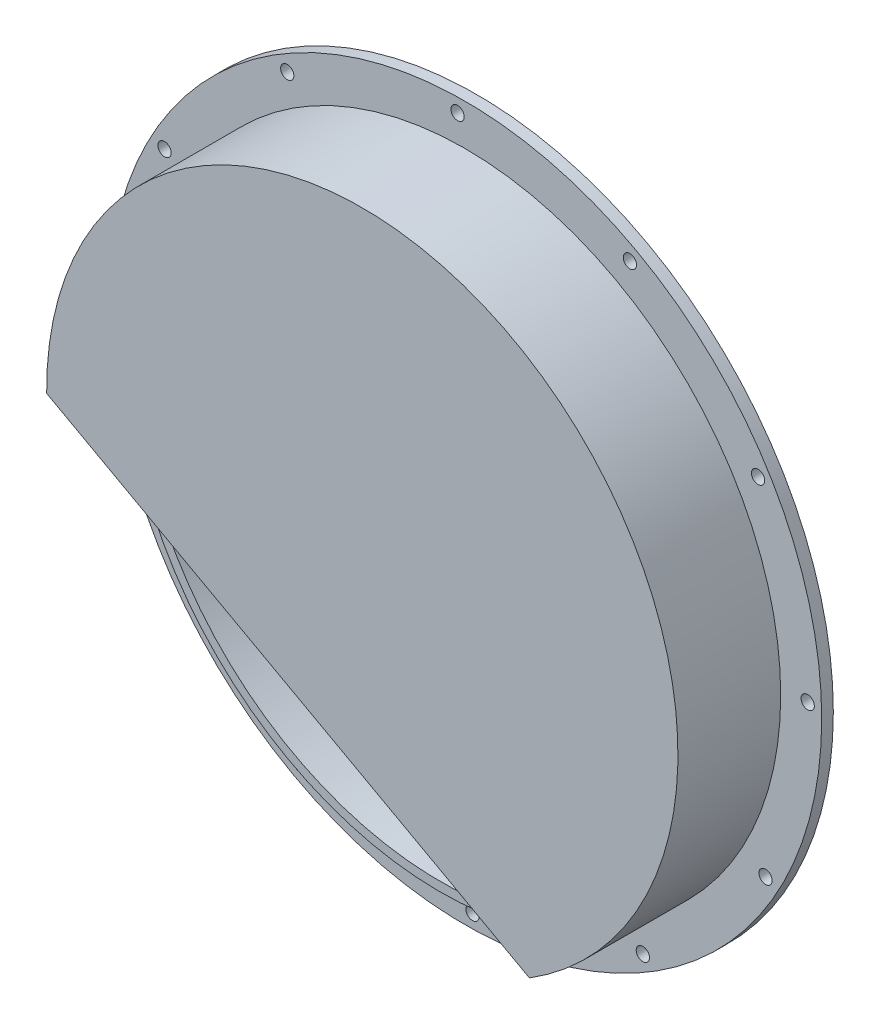
ISO-10303-21;
HEADER;
FILE_DESCRIPTION(('STEP AP214'),'2;1');
FILE_NAME('part.step','',(''),(''),'','','');
FILE_SCHEMA(('AUTOMOTIVE_DESIGN { 1 0 10303 214 1 1 1 1 }'));
ENDSEC;
DATA;
#1=APPLICATION_CONTEXT('core data for automotive mechanical design processes');
#2=APPLICATION_PROTOCOL_DEFINITION('international standard','automotive_design',2000,#1);
#3=PRODUCT_CONTEXT('',#1,'mechanical');
#4=PRODUCT('Part','Part','',(#3));
#5=PRODUCT_RELATED_PRODUCT_CATEGORY('part','',(#4));
#6=PRODUCT_DEFINITION_FORMATION('','',#4);
#7=PRODUCT_DEFINITION_CONTEXT('part definition',#1,'design');
#8=PRODUCT_DEFINITION('design','',#6,#7);
#9=PRODUCT_DEFINITION_SHAPE('','',#8);
#10=(LENGTH_UNIT() NAMED_UNIT(*) SI_UNIT(.MILLI.,.METRE.));
#11=(NAMED_UNIT(*) PLANE_ANGLE_UNIT() SI_UNIT($,.RADIAN.));
#12=(NAMED_UNIT(*) SI_UNIT($,.STERADIAN.) SOLID_ANGLE_UNIT());
#13=UNCERTAINTY_MEASURE_WITH_UNIT(LENGTH_MEASURE(1.E-05),#10,'distance_accuracy_value','');
#14=(GEOMETRIC_REPRESENTATION_CONTEXT(3) GLOBAL_UNCERTAINTY_ASSIGNED_CONTEXT((#13)) GLOBAL_UNIT_ASSIGNED_CONTEXT((#10,
#11,#12)) REPRESENTATION_CONTEXT('',''));
#15=CARTESIAN_POINT('',(0.,0.,0.));
#16=DIRECTION('',(0.,0.,1.));
#17=DIRECTION('',(1.,0.,0.));
#18=AXIS2_PLACEMENT_3D('',#15,#16,#17);
#19=CARTESIAN_POINT('',(0.,0.,0.));
#20=DIRECTION('',(0.,0.,1.));
#21=DIRECTION('',(1.,0.,0.));
#22=AXIS2_PLACEMENT_3D('',#19,#20,#21);
#23=PLANE('',#22);
#24=CARTESIAN_POINT('',(-121.492546333434,-69.9540973807886,0.));
#25=DIRECTION('',(0.,0.,-1.));
#26=DIRECTION('',(-1.,0.,0.));
#27=AXIS2_PLACEMENT_3D('',#24,#25,#26);
#28=CIRCLE('',#27,1.45);
#29=CARTESIAN_POINT('',(-122.942546333434,-69.9540973807886,0.));
#30=VERTEX_POINT('',#29);
#31=EDGE_CURVE('E166',#30,#30,#28,.T.);
#32=ORIENTED_EDGE('',*,*,#31,.F.);
#33=EDGE_LOOP('',(#32));
#34=FACE_BOUND('',#33,.T.);
#35=CARTESIAN_POINT('',(-57.4334190667852,-31.0833742869837,0.));
#36=DIRECTION('',(0.,0.,-1.));
#37=DIRECTION('',(-1.,0.,0.));
#38=AXIS2_PLACEMENT_3D('',#35,#36,#37);
#39=CIRCLE('',#38,1.44999999999999);
#40=CARTESIAN_POINT('',(-58.8834190667852,-31.0833742869837,0.));
#41=VERTEX_POINT('',#40);
#42=EDGE_CURVE('E163',#41,#41,#39,.T.);
#43=ORIENTED_EDGE('',*,*,#42,.F.);
#44=EDGE_LOOP('',(#43));
#45=FACE_BOUND('',#44,.T.);
#46=CARTESIAN_POINT('',(-48.2138232587343,6.5915657526732,0.));
#47=DIRECTION('',(0.,0.,-1.));
#48=DIRECTION('',(-1.,0.,0.));
#49=AXIS2_PLACEMENT_3D('',#46,#47,#48);
#50=CIRCLE('',#49,1.44999999999999);
#51=CARTESIAN_POINT('',(-49.6638232587343,6.5915657526732,0.));
#52=VERTEX_POINT('',#51);
#53=EDGE_CURVE('E175',#52,#52,#50,.T.);
#54=ORIENTED_EDGE('',*,*,#53,.F.);
#55=EDGE_LOOP('',(#54));
#56=FACE_BOUND('',#55,.T.);
#57=CARTESIAN_POINT('',(-59.0668890961661,43.8288188170972,0.));
#58=DIRECTION('',(0.,0.,-1.));
#59=DIRECTION('',(-1.,0.,0.));
#60=AXIS2_PLACEMENT_3D('',#57,#58,#59);
#61=CIRCLE('',#60,1.44999999999999);
#62=CARTESIAN_POINT('',(-60.5168890961661,43.8288188170972,0.));
#63=VERTEX_POINT('',#62);
#64=EDGE_CURVE('E181',#63,#63,#61,.T.);
#65=ORIENTED_EDGE('',*,*,#64,.F.);
#66=EDGE_LOOP('',(#65));
#67=FACE_BOUND('',#66,.T.);
#68=CARTESIAN_POINT('',(-87.0845463525391,70.6506930193223,0.));
#69=DIRECTION('',(0.,0.,-1.));
#70=DIRECTION('',(-1.,0.,0.));
#71=AXIS2_PLACEMENT_3D('',#68,#69,#70);
#72=CIRCLE('',#71,1.45);
#73=CARTESIAN_POINT('',(-88.5345463525391,70.6506930193223,0.));
#74=VERTEX_POINT('',#73);
#75=EDGE_CURVE('E187',#74,#74,#72,.T.);
#76=ORIENTED_EDGE('',*,*,#75,.F.);
#77=EDGE_LOOP('',(#76));
#78=FACE_BOUND('',#77,.T.);
#79=CARTESIAN_POINT('',(-124.759486392196,79.8702888273732,0.));
#80=DIRECTION('',(0.,0.,-1.));
#81=DIRECTION('',(-1.,0.,0.));
#82=AXIS2_PLACEMENT_3D('',#79,#80,#81);
#83=CIRCLE('',#82,1.45);
#84=CARTESIAN_POINT('',(-126.209486392196,79.8702888273732,0.));
#85=VERTEX_POINT('',#84);
#86=EDGE_CURVE('E193',#85,#85,#83,.T.);
#87=ORIENTED_EDGE('',*,*,#86,.F.);
#88=EDGE_LOOP('',(#87));
#89=FACE_BOUND('',#88,.T.);
#90=CARTESIAN_POINT('',(-161.99673945662,69.0172229899414,0.));
#91=DIRECTION('',(0.,0.,-1.));
#92=DIRECTION('',(-1.,0.,0.));
#93=AXIS2_PLACEMENT_3D('',#90,#91,#92);
#94=CIRCLE('',#93,1.44999999999998);
#95=CARTESIAN_POINT('',(-163.44673945662,69.0172229899414,0.));
#96=VERTEX_POINT('',#95);
#97=EDGE_CURVE('E199',#96,#96,#94,.T.);
#98=ORIENTED_EDGE('',*,*,#97,.F.);
#99=EDGE_LOOP('',(#98));
#100=FACE_BOUND('',#99,.T.);
#101=CARTESIAN_POINT('',(-188.818613658845,40.9995657335684,0.));
#102=DIRECTION('',(0.,0.,-1.));
#103=DIRECTION('',(-1.,0.,0.));
#104=AXIS2_PLACEMENT_3D('',#101,#102,#103);
#105=CIRCLE('',#104,1.44999999999998);
#106=CARTESIAN_POINT('',(-190.268613658845,40.9995657335684,0.));
#107=VERTEX_POINT('',#106);
#108=EDGE_CURVE('E205',#107,#107,#105,.T.);
#109=ORIENTED_EDGE('',*,*,#108,.F.);
#110=EDGE_LOOP('',(#109));
#111=FACE_BOUND('',#110,.T.);
#112=CARTESIAN_POINT('',(-198.038209466896,3.32462569391143,0.));
#113=DIRECTION('',(0.,0.,-1.));
#114=DIRECTION('',(-1.,0.,0.));
#115=AXIS2_PLACEMENT_3D('',#112,#113,#114);
#116=CIRCLE('',#115,1.44999999999998);
#117=CARTESIAN_POINT('',(-199.488209466896,3.32462569391143,0.));
#118=VERTEX_POINT('',#117);
#119=EDGE_CURVE('E211',#118,#118,#116,.T.);
#120=ORIENTED_EDGE('',*,*,#119,.F.);
#121=EDGE_LOOP('',(#120));
#122=FACE_BOUND('',#121,.T.);
#123=CARTESIAN_POINT('',(-187.185143629464,-33.9126273705125,0.));
#124=DIRECTION('',(0.,0.,-1.));
#125=DIRECTION('',(-1.,0.,0.));
#126=AXIS2_PLACEMENT_3D('',#123,#124,#125);
#127=CIRCLE('',#126,1.44999999999998);
#128=CARTESIAN_POINT('',(-188.635143629464,-33.9126273705125,0.));
#129=VERTEX_POINT('',#128);
#130=EDGE_CURVE('E217',#129,#129,#127,.T.);
#131=ORIENTED_EDGE('',*,*,#130,.F.);
#132=EDGE_LOOP('',(#131));
#133=FACE_BOUND('',#132,.T.);
#134=CARTESIAN_POINT('',(-159.167486373091,-60.7345015727377,0.));
#135=DIRECTION('',(0.,0.,-1.));
#136=DIRECTION('',(-1.,0.,0.));
#137=AXIS2_PLACEMENT_3D('',#134,#135,#136);
#138=CIRCLE('',#137,1.44999999999998);
#139=CARTESIAN_POINT('',(-160.617486373091,-60.7345015727377,0.));
#140=VERTEX_POINT('',#139);
#141=EDGE_CURVE('E223',#140,#140,#138,.T.);
#142=ORIENTED_EDGE('',*,*,#141,.F.);
#143=EDGE_LOOP('',(#142));
#144=FACE_BOUND('',#143,.T.);
#145=CARTESIAN_POINT('',(-123.126016362815,4.95809572329235,0.));
#146=DIRECTION('',(0.,0.,1.));
#147=DIRECTION('',(1.,0.,0.));
#148=AXIS2_PLACEMENT_3D('',#145,#146,#147);
#149=CIRCLE('',#148,77.978);
#150=CARTESIAN_POINT('',(-45.1480163628152,4.95809572329235,0.));
#151=VERTEX_POINT('',#150);
#152=EDGE_CURVE('E142',#151,#151,#149,.T.);
#153=ORIENTED_EDGE('',*,*,#152,.F.);
#154=EDGE_LOOP('',(#153));
#155=FACE_BOUND('',#154,.T.);
#156=CARTESIAN_POINT('',(-123.126016362815,4.95809572329236,0.));
#157=DIRECTION('',(0.,0.,1.));
#158=DIRECTION('',(1.,0.,0.));
#159=AXIS2_PLACEMENT_3D('',#156,#157,#158);
#160=CIRCLE('',#159,67.0115996692061);
#161=CARTESIAN_POINT('',(-56.1144166936093,4.95809572329236,0.));
#162=VERTEX_POINT('',#161);
#163=EDGE_CURVE('E139',#162,#162,#160,.T.);
#164=ORIENTED_EDGE('',*,*,#163,.T.);
#165=EDGE_LOOP('',(#164));
#166=FACE_BOUND('',#165,.T.);
#167=CARTESIAN_POINT('',(-84.2552932690104,-59.1010315433568,0.));
#168=DIRECTION('',(0.,0.,-1.));
#169=DIRECTION('',(-1.,0.,0.));
#170=AXIS2_PLACEMENT_3D('',#167,#168,#169);
#171=CIRCLE('',#170,1.45);
#172=CARTESIAN_POINT('',(-85.7052932690104,-59.1010315433568,0.));
#173=VERTEX_POINT('',#172);
#174=EDGE_CURVE('E157',#173,#173,#171,.T.);
#175=ORIENTED_EDGE('',*,*,#174,.F.);
#176=EDGE_LOOP('',(#175));
#177=FACE_BOUND('',#176,.T.);
#178=ADVANCED_FACE('F17',(#34,#45,#56,#67,#78,#89,#100,#111,#122,#133,#144,#155,#166,#177),#23,.F.);
#179=CARTESIAN_POINT('',(-123.126016362815,4.95809572329236,2.54));
#180=DIRECTION('',(0.,0.,-1.));
#181=DIRECTION('',(-1.,0.,0.));
#182=AXIS2_PLACEMENT_3D('',#179,#180,#181);
#183=CYLINDRICAL_SURFACE('',#182,67.0115996692061);
#184=DIRECTION('',(0.,0.,1.));
#185=VECTOR('',#184,1.);
#186=CARTESIAN_POINT('',(-190.135379647443,5.50556482266202,-110.616161101414));
#187=LINE('',#186,#185);
#188=CARTESIAN_POINT('',(-190.135379647443,5.50556482266201,8.5));
#189=VERTEX_POINT('',#188);
#190=CARTESIAN_POINT('',(-190.135379647443,5.50556482266202,23.));
#191=VERTEX_POINT('',#190);
#192=EDGE_CURVE('E98',#189,#191,#187,.T.);
#193=ORIENTED_EDGE('',*,*,#192,.F.);
#194=CARTESIAN_POINT('',(-123.126016362815,4.95809572329236,8.5));
#195=DIRECTION('',(0.,0.,1.));
#196=DIRECTION('',(1.,0.,0.));
#197=AXIS2_PLACEMENT_3D('',#194,#195,#196);
#198=CIRCLE('',#197,67.0115996692061);
#199=CARTESIAN_POINT('',(-190.114892929167,3.2131296479842,8.5));
#200=VERTEX_POINT('',#199);
#201=EDGE_CURVE('E36',#189,#200,#198,.T.);
#202=ORIENTED_EDGE('',*,*,#201,.T.);
#203=DIRECTION('',(0.,0.,1.));
#204=VECTOR('',#203,1.);
#205=CARTESIAN_POINT('',(-190.114892929167,3.2131296479842,-110.616161101414));
#206=LINE('',#205,#204);
#207=CARTESIAN_POINT('',(-190.114892929167,3.2131296479842,8.00000002799998));
#208=VERTEX_POINT('',#207);
#209=EDGE_CURVE('E88',#200,#208,#206,.F.);
#210=ORIENTED_EDGE('',*,*,#209,.T.);
#211=CARTESIAN_POINT('',(-123.126016362815,4.95809572329236,8.00000002799999));
#212=DIRECTION('',(0.,0.,-1.));
#213=DIRECTION('',(-1.,0.,0.));
#214=AXIS2_PLACEMENT_3D('',#211,#212,#213);
#215=CIRCLE('',#214,67.0115996692061);
#216=CARTESIAN_POINT('',(-88.6031091756951,-52.4764180256323,8.00000002799998));
#217=VERTEX_POINT('',#216);
#218=EDGE_CURVE('E117',#217,#208,#215,.T.);
#219=ORIENTED_EDGE('',*,*,#218,.F.);
#220=DIRECTION('',(0.,0.,1.));
#221=VECTOR('',#220,1.);
#222=CARTESIAN_POINT('',(-88.6031091756951,-52.4764180256323,-110.616161101414));
#223=LINE('',#222,#221);
#224=CARTESIAN_POINT('',(-88.6031091756951,-52.4764180256323,8.5));
#225=VERTEX_POINT('',#224);
#226=EDGE_CURVE('E21',#225,#217,#223,.F.);
#227=ORIENTED_EDGE('',*,*,#226,.F.);
#228=CARTESIAN_POINT('',(-123.126016362815,4.95809572329236,8.5));
#229=DIRECTION('',(0.,0.,1.));
#230=DIRECTION('',(1.,0.,0.));
#231=AXIS2_PLACEMENT_3D('',#228,#229,#230);
#232=CIRCLE('',#231,67.0115996692061);
#233=CARTESIAN_POINT('',(-86.6587131608728,-51.2619210625778,8.5));
#234=VERTEX_POINT('',#233);
#235=EDGE_CURVE('E76',#225,#234,#232,.T.);
#236=ORIENTED_EDGE('',*,*,#235,.T.);
#237=DIRECTION('',(0.,0.,1.));
#238=VECTOR('',#237,1.);
#239=CARTESIAN_POINT('',(-86.6587131608728,-51.2619210625778,-110.616161101414));
#240=LINE('',#239,#238);
#241=CARTESIAN_POINT('',(-86.6587131608728,-51.2619210625778,23.));
#242=VERTEX_POINT('',#241);
#243=EDGE_CURVE('E82',#234,#242,#240,.T.);
#244=ORIENTED_EDGE('',*,*,#243,.T.);
#245=CARTESIAN_POINT('',(-123.126016362815,4.95809572329236,23.));
#246=DIRECTION('',(0.,0.,-1.));
#247=DIRECTION('',(-1.,0.,0.));
#248=AXIS2_PLACEMENT_3D('',#245,#246,#247);
#249=CIRCLE('',#248,67.0115996692061);
#250=EDGE_CURVE('E103',#191,#242,#249,.T.);
#251=ORIENTED_EDGE('',*,*,#250,.F.);
#252=EDGE_LOOP('',(#193,#202,#210,#219,#227,#236,#244,#251));
#253=FACE_BOUND('',#252,.T.);
#254=ORIENTED_EDGE('',*,*,#163,.F.);
#255=EDGE_LOOP('',(#254));
#256=FACE_BOUND('',#255,.T.);
#257=ADVANCED_FACE('F78',(#253,#256),#183,.F.);
#258=CARTESIAN_POINT('',(-123.126016362815,4.95809572329235,2.54));
#259=DIRECTION('',(0.,0.,-1.));
#260=DIRECTION('',(-1.,0.,0.));
#261=AXIS2_PLACEMENT_3D('',#258,#259,#260);
#262=CYLINDRICAL_SURFACE('',#261,77.978);
#263=CARTESIAN_POINT('',(-123.126016362815,4.95809572329235,2.54));
#264=DIRECTION('',(0.,0.,1.));
#265=DIRECTION('',(1.,0.,0.));
#266=AXIS2_PLACEMENT_3D('',#263,#264,#265);
#267=CIRCLE('',#266,77.978);
#268=CARTESIAN_POINT('',(-45.1480163628152,4.95809572329235,2.54));
#269=VERTEX_POINT('',#268);
#270=EDGE_CURVE('E27',#269,#269,#267,.T.);
#271=ORIENTED_EDGE('',*,*,#270,.F.);
#272=EDGE_LOOP('',(#271));
#273=FACE_BOUND('',#272,.T.);
#274=ORIENTED_EDGE('',*,*,#152,.T.);
#275=EDGE_LOOP('',(#274));
#276=FACE_BOUND('',#275,.T.);
#277=ADVANCED_FACE('F147',(#273,#276),#262,.T.);
#278=CARTESIAN_POINT('',(0.,0.,2.54));
#279=DIRECTION('',(0.,0.,1.));
#280=DIRECTION('',(1.,0.,0.));
#281=AXIS2_PLACEMENT_3D('',#278,#279,#280);
#282=PLANE('',#281);
#283=CARTESIAN_POINT('',(-121.492546333434,-69.9540973807886,2.54));
#284=DIRECTION('',(0.,0.,1.));
#285=DIRECTION('',(1.,0.,0.));
#286=AXIS2_PLACEMENT_3D('',#283,#284,#285);
#287=CIRCLE('',#286,1.45);
#288=CARTESIAN_POINT('',(-120.042546333434,-69.9540973807886,2.54));
#289=VERTEX_POINT('',#288);
#290=EDGE_CURVE('E160',#289,#289,#287,.T.);
#291=ORIENTED_EDGE('',*,*,#290,.F.);
#292=EDGE_LOOP('',(#291));
#293=FACE_BOUND('',#292,.T.);
#294=CARTESIAN_POINT('',(-84.2552932690104,-59.1010315433568,2.54));
#295=DIRECTION('',(0.,0.,1.));
#296=DIRECTION('',(1.,0.,0.));
#297=AXIS2_PLACEMENT_3D('',#294,#295,#296);
#298=CIRCLE('',#297,1.45);
#299=CARTESIAN_POINT('',(-82.8052932690104,-59.1010315433568,2.54));
#300=VERTEX_POINT('',#299);
#301=EDGE_CURVE('E159',#300,#300,#298,.T.);
#302=ORIENTED_EDGE('',*,*,#301,.F.);
#303=EDGE_LOOP('',(#302));
#304=FACE_BOUND('',#303,.T.);
#305=CARTESIAN_POINT('',(-57.4334190667852,-31.0833742869837,2.54));
#306=DIRECTION('',(0.,0.,1.));
#307=DIRECTION('',(1.,0.,0.));
#308=AXIS2_PLACEMENT_3D('',#305,#306,#307);
#309=CIRCLE('',#308,1.45);
#310=CARTESIAN_POINT('',(-55.9834190667852,-31.0833742869837,2.54));
#311=VERTEX_POINT('',#310);
#312=EDGE_CURVE('E172',#311,#311,#309,.T.);
#313=ORIENTED_EDGE('',*,*,#312,.F.);
#314=EDGE_LOOP('',(#313));
#315=FACE_BOUND('',#314,.T.);
#316=CARTESIAN_POINT('',(-48.2138232587343,6.5915657526732,2.54));
#317=DIRECTION('',(0.,0.,1.));
#318=DIRECTION('',(1.,0.,0.));
#319=AXIS2_PLACEMENT_3D('',#316,#317,#318);
#320=CIRCLE('',#319,1.45);
#321=CARTESIAN_POINT('',(-46.7638232587343,6.5915657526732,2.54));
#322=VERTEX_POINT('',#321);
#323=EDGE_CURVE('E178',#322,#322,#320,.T.);
#324=ORIENTED_EDGE('',*,*,#323,.F.);
#325=EDGE_LOOP('',(#324));
#326=FACE_BOUND('',#325,.T.);
#327=CARTESIAN_POINT('',(-59.0668890961661,43.8288188170972,2.54));
#328=DIRECTION('',(0.,0.,1.));
#329=DIRECTION('',(1.,0.,0.));
#330=AXIS2_PLACEMENT_3D('',#327,#328,#329);
#331=CIRCLE('',#330,1.45);
#332=CARTESIAN_POINT('',(-57.6168890961661,43.8288188170972,2.54));
#333=VERTEX_POINT('',#332);
#334=EDGE_CURVE('E184',#333,#333,#331,.T.);
#335=ORIENTED_EDGE('',*,*,#334,.F.);
#336=EDGE_LOOP('',(#335));
#337=FACE_BOUND('',#336,.T.);
#338=CARTESIAN_POINT('',(-87.0845463525391,70.6506930193223,2.54));
#339=DIRECTION('',(0.,0.,1.));
#340=DIRECTION('',(1.,0.,0.));
#341=AXIS2_PLACEMENT_3D('',#338,#339,#340);
#342=CIRCLE('',#341,1.45);
#343=CARTESIAN_POINT('',(-85.6345463525391,70.6506930193223,2.54));
#344=VERTEX_POINT('',#343);
#345=EDGE_CURVE('E190',#344,#344,#342,.T.);
#346=ORIENTED_EDGE('',*,*,#345,.F.);
#347=EDGE_LOOP('',(#346));
#348=FACE_BOUND('',#347,.T.);
#349=CARTESIAN_POINT('',(-124.759486392196,79.8702888273732,2.54));
#350=DIRECTION('',(0.,0.,1.));
#351=DIRECTION('',(1.,0.,0.));
#352=AXIS2_PLACEMENT_3D('',#349,#350,#351);
#353=CIRCLE('',#352,1.45);
#354=CARTESIAN_POINT('',(-123.309486392196,79.8702888273732,2.54));
#355=VERTEX_POINT('',#354);
#356=EDGE_CURVE('E196',#355,#355,#353,.T.);
#357=ORIENTED_EDGE('',*,*,#356,.F.);
#358=EDGE_LOOP('',(#357));
#359=FACE_BOUND('',#358,.T.);
#360=CARTESIAN_POINT('',(-161.99673945662,69.0172229899414,2.54));
#361=DIRECTION('',(0.,0.,1.));
#362=DIRECTION('',(1.,0.,0.));
#363=AXIS2_PLACEMENT_3D('',#360,#361,#362);
#364=CIRCLE('',#363,1.45);
#365=CARTESIAN_POINT('',(-160.54673945662,69.0172229899414,2.54));
#366=VERTEX_POINT('',#365);
#367=EDGE_CURVE('E202',#366,#366,#364,.T.);
#368=ORIENTED_EDGE('',*,*,#367,.F.);
#369=EDGE_LOOP('',(#368));
#370=FACE_BOUND('',#369,.T.);
#371=CARTESIAN_POINT('',(-188.818613658845,40.9995657335684,2.54));
#372=DIRECTION('',(0.,0.,1.));
#373=DIRECTION('',(1.,0.,0.));
#374=AXIS2_PLACEMENT_3D('',#371,#372,#373);
#375=CIRCLE('',#374,1.45);
#376=CARTESIAN_POINT('',(-187.368613658845,40.9995657335684,2.54));
#377=VERTEX_POINT('',#376);
#378=EDGE_CURVE('E208',#377,#377,#375,.T.);
#379=ORIENTED_EDGE('',*,*,#378,.F.);
#380=EDGE_LOOP('',(#379));
#381=FACE_BOUND('',#380,.T.);
#382=CARTESIAN_POINT('',(-198.038209466896,3.32462569391143,2.54));
#383=DIRECTION('',(0.,0.,1.));
#384=DIRECTION('',(1.,0.,0.));
#385=AXIS2_PLACEMENT_3D('',#382,#383,#384);
#386=CIRCLE('',#385,1.45);
#387=CARTESIAN_POINT('',(-196.588209466896,3.32462569391143,2.54));
#388=VERTEX_POINT('',#387);
#389=EDGE_CURVE('E214',#388,#388,#386,.T.);
#390=ORIENTED_EDGE('',*,*,#389,.F.);
#391=EDGE_LOOP('',(#390));
#392=FACE_BOUND('',#391,.T.);
#393=CARTESIAN_POINT('',(-187.185143629464,-33.9126273705125,2.54));
#394=DIRECTION('',(0.,0.,1.));
#395=DIRECTION('',(1.,0.,0.));
#396=AXIS2_PLACEMENT_3D('',#393,#394,#395);
#397=CIRCLE('',#396,1.45);
#398=CARTESIAN_POINT('',(-185.735143629464,-33.9126273705125,2.54));
#399=VERTEX_POINT('',#398);
#400=EDGE_CURVE('E220',#399,#399,#397,.T.);
#401=ORIENTED_EDGE('',*,*,#400,.F.);
#402=EDGE_LOOP('',(#401));
#403=FACE_BOUND('',#402,.T.);
#404=CARTESIAN_POINT('',(-159.167486373091,-60.7345015727377,2.54));
#405=DIRECTION('',(0.,0.,1.));
#406=DIRECTION('',(1.,0.,0.));
#407=AXIS2_PLACEMENT_3D('',#404,#405,#406);
#408=CIRCLE('',#407,1.45);
#409=CARTESIAN_POINT('',(-157.717486373092,-60.7345015727377,2.54));
#410=VERTEX_POINT('',#409);
#411=EDGE_CURVE('E109',#410,#410,#408,.T.);
#412=ORIENTED_EDGE('',*,*,#411,.F.);
#413=EDGE_LOOP('',(#412));
#414=FACE_BOUND('',#413,.T.);
#415=CARTESIAN_POINT('',(-123.126016362815,4.95809572329235,2.54));
#416=DIRECTION('',(0.,0.,1.));
#417=DIRECTION('',(1.,0.,0.));
#418=AXIS2_PLACEMENT_3D('',#415,#416,#417);
#419=CIRCLE('',#418,69.0115996692059);
#420=CARTESIAN_POINT('',(-54.1144166936093,4.95809572329235,2.54));
#421=VERTEX_POINT('',#420);
#422=EDGE_CURVE('E116',#421,#421,#419,.F.);
#423=ORIENTED_EDGE('',*,*,#422,.T.);
#424=EDGE_LOOP('',(#423));
#425=FACE_BOUND('',#424,.T.);
#426=ORIENTED_EDGE('',*,*,#270,.T.);
#427=EDGE_LOOP('',(#426));
#428=FACE_BOUND('',#427,.T.);
#429=ADVANCED_FACE('F249',(#293,#304,#315,#326,#337,#348,#359,#370,#381,#392,#403,#414,#425,
#428),#282,.T.);
#430=CARTESIAN_POINT('',(-123.126016362815,4.95809572329235,228.194280426507));
#431=DIRECTION('',(0.,0.,-1.));
#432=DIRECTION('',(-1.,0.,0.));
#433=AXIS2_PLACEMENT_3D('',#430,#431,#432);
#434=CYLINDRICAL_SURFACE('',#433,69.0115996692059);
#435=ORIENTED_EDGE('',*,*,#422,.F.);
#436=EDGE_LOOP('',(#435));
#437=FACE_BOUND('',#436,.T.);
#438=CARTESIAN_POINT('',(-123.126016362815,4.95809572329235,8.000000028));
#439=DIRECTION('',(0.,0.,-1.));
#440=DIRECTION('',(-1.,0.,0.));
#441=AXIS2_PLACEMENT_3D('',#438,#439,#440);
#442=CIRCLE('',#441,69.0115996692059);
#443=CARTESIAN_POINT('',(-86.5833251556242,-53.5844751823198,8.00000002799999));
#444=VERTEX_POINT('',#443);
#445=CARTESIAN_POINT('',(-192.134676949238,4.32118680467145,8.00000002799999));
#446=VERTEX_POINT('',#445);
#447=EDGE_CURVE('E114',#444,#446,#442,.T.);
#448=ORIENTED_EDGE('',*,*,#447,.T.);
#449=DIRECTION('',(0.,0.,-1.));
#450=VECTOR('',#449,1.);
#451=CARTESIAN_POINT('',(-192.134676949238,4.32118680467145,25.));
#452=LINE('',#451,#450);
#453=CARTESIAN_POINT('',(-192.134676949238,4.32118680467145,25.));
#454=VERTEX_POINT('',#453);
#455=EDGE_CURVE('E127',#454,#446,#452,.T.);
#456=ORIENTED_EDGE('',*,*,#455,.F.);
#457=CARTESIAN_POINT('',(-123.126016362815,4.95809572329235,25.));
#458=DIRECTION('',(0.,0.,1.));
#459=DIRECTION('',(1.,0.,0.));
#460=AXIS2_PLACEMENT_3D('',#457,#458,#459);
#461=CIRCLE('',#460,69.0115996692059);
#462=CARTESIAN_POINT('',(-86.5833251556242,-53.5844751823198,25.));
#463=VERTEX_POINT('',#462);
#464=EDGE_CURVE('E62',#463,#454,#461,.T.);
#465=ORIENTED_EDGE('',*,*,#464,.F.);
#466=DIRECTION('',(0.,0.,-1.));
#467=VECTOR('',#466,1.);
#468=CARTESIAN_POINT('',(-86.5833251556242,-53.5844751823198,25.));
#469=LINE('',#468,#467);
#470=EDGE_CURVE('E131',#463,#444,#469,.T.);
#471=ORIENTED_EDGE('',*,*,#470,.T.);
#472=EDGE_LOOP('',(#448,#456,#465,#471));
#473=FACE_BOUND('',#472,.T.);
#474=ADVANCED_FACE('F130',(#437,#473),#434,.T.);
#475=CARTESIAN_POINT('',(-116.90096210872,16.3018282714156,8.00000002799999));
#476=DIRECTION('',(0.,0.,-1.));
#477=DIRECTION('',(0.876672363678299,-0.481087899206272,0.));
#478=AXIS2_PLACEMENT_3D('',#475,#476,#477);
#479=PLANE('',#478);
#480=ORIENTED_EDGE('',*,*,#447,.F.);
#481=DIRECTION('',(-0.876733034433079,0.480977324136768,0.));
#482=VECTOR('',#481,1.);
#483=CARTESIAN_POINT('',(-139.357569716505,-24.6324294222953,8.00000002799999));
#484=LINE('',#483,#482);
#485=EDGE_CURVE('E54',#444,#217,#484,.T.);
#486=ORIENTED_EDGE('',*,*,#485,.T.);
#487=ORIENTED_EDGE('',*,*,#218,.T.);
#488=DIRECTION('',(-0.876733034433079,0.480977324136768,0.));
#489=VECTOR('',#488,1.);
#490=CARTESIAN_POINT('',(-139.357569716505,-24.6324294222953,8.00000002799999));
#491=LINE('',#490,#489);
#492=EDGE_CURVE('E11',#208,#446,#491,.T.);
#493=ORIENTED_EDGE('',*,*,#492,.T.);
#494=EDGE_LOOP('',(#480,#486,#487,#493));
#495=FACE_BOUND('',#494,.T.);
#496=ADVANCED_FACE('F19',(#495),#479,.F.);
#497=CARTESIAN_POINT('',(0.,0.,23.));
#498=DIRECTION('',(0.,0.,1.));
#499=DIRECTION('',(1.,0.,0.));
#500=AXIS2_PLACEMENT_3D('',#497,#498,#499);
#501=PLANE('',#500);
#502=ORIENTED_EDGE('',*,*,#250,.T.);
#503=DIRECTION('',(-0.876733034433079,0.480977324136768,0.));
#504=VECTOR('',#503,1.);
#505=CARTESIAN_POINT('',(-41.6641294991559,-75.9460308204067,23.));
#506=LINE('',#505,#504);
#507=EDGE_CURVE('E97',#242,#191,#506,.T.);
#508=ORIENTED_EDGE('',*,*,#507,.T.);
#509=EDGE_LOOP('',(#502,#508));
#510=FACE_BOUND('',#509,.T.);
#511=ADVANCED_FACE('F240',(#510),#501,.F.);
#512=CARTESIAN_POINT('',(-42.6260841474295,-77.6994968892729,25.));
#513=DIRECTION('',(-0.480977324136768,-0.876733034433079,0.));
#514=DIRECTION('',(0.876733034433079,-0.480977324136768,0.));
#515=AXIS2_PLACEMENT_3D('',#512,#513,#514);
#516=PLANE('',#515);
#517=ORIENTED_EDGE('',*,*,#485,.F.);
#518=ORIENTED_EDGE('',*,*,#470,.F.);
#519=DIRECTION('',(-0.876733034433079,0.480977324136768,0.));
#520=VECTOR('',#519,1.);
#521=CARTESIAN_POINT('',(-42.6260841474295,-77.6994968892729,25.));
#522=LINE('',#521,#520);
#523=EDGE_CURVE('E120',#463,#454,#522,.T.);
#524=ORIENTED_EDGE('',*,*,#523,.T.);
#525=ORIENTED_EDGE('',*,*,#455,.T.);
#526=ORIENTED_EDGE('',*,*,#492,.F.);
#527=ORIENTED_EDGE('',*,*,#209,.F.);
#528=DIRECTION('',(0.876733034433079,-0.480977324136768,0.));
#529=VECTOR('',#528,1.);
#530=CARTESIAN_POINT('',(-42.6260841474295,-77.6994968892729,8.5));
#531=LINE('',#530,#529);
#532=EDGE_CURVE('E121',#200,#225,#531,.T.);
#533=ORIENTED_EDGE('',*,*,#532,.T.);
#534=ORIENTED_EDGE('',*,*,#226,.T.);
#535=EDGE_LOOP('',(#517,#518,#524,#525,#526,#527,#533,#534));
#536=FACE_BOUND('',#535,.T.);
#537=ADVANCED_FACE('F125',(#536),#516,.T.);
#538=CARTESIAN_POINT('',(0.,0.,25.));
#539=DIRECTION('',(0.,0.,1.));
#540=DIRECTION('',(1.,0.,0.));
#541=AXIS2_PLACEMENT_3D('',#538,#539,#540);
#542=PLANE('',#541);
#543=ORIENTED_EDGE('',*,*,#523,.F.);
#544=ORIENTED_EDGE('',*,*,#464,.T.);
#545=EDGE_LOOP('',(#543,#544));
#546=FACE_BOUND('',#545,.T.);
#547=ADVANCED_FACE('F230',(#546),#542,.T.);
#548=CARTESIAN_POINT('',(-41.6641294991559,-75.9460308204067,-110.616161101414));
#549=DIRECTION('',(0.480977324136768,0.876733034433079,0.));
#550=DIRECTION('',(-0.876733034433079,0.480977324136768,0.));
#551=AXIS2_PLACEMENT_3D('',#548,#549,#550);
#552=PLANE('',#551);
#553=DIRECTION('',(0.876733034433079,-0.480977324136768,0.));
#554=VECTOR('',#553,1.);
#555=CARTESIAN_POINT('',(-41.6641294991559,-75.9460308204067,8.5));
#556=LINE('',#555,#554);
#557=EDGE_CURVE('E87',#189,#234,#556,.T.);
#558=ORIENTED_EDGE('',*,*,#557,.F.);
#559=ORIENTED_EDGE('',*,*,#192,.T.);
#560=ORIENTED_EDGE('',*,*,#507,.F.);
#561=ORIENTED_EDGE('',*,*,#243,.F.);
#562=EDGE_LOOP('',(#558,#559,#560,#561));
#563=FACE_BOUND('',#562,.T.);
#564=ADVANCED_FACE('F96',(#563),#552,.T.);
#565=CARTESIAN_POINT('',(-123.126016362815,4.95809572329226,8.5));
#566=DIRECTION('',(0.,0.,1.));
#567=DIRECTION('',(0.876672363678299,-0.481087899206272,0.));
#568=AXIS2_PLACEMENT_3D('',#565,#566,#567);
#569=PLANE('',#568);
#570=ORIENTED_EDGE('',*,*,#201,.F.);
#571=ORIENTED_EDGE('',*,*,#557,.T.);
#572=ORIENTED_EDGE('',*,*,#235,.F.);
#573=ORIENTED_EDGE('',*,*,#532,.F.);
#574=EDGE_LOOP('',(#570,#571,#572,#573));
#575=FACE_BOUND('',#574,.T.);
#576=ADVANCED_FACE('F91',(#575),#569,.F.);
#577=CARTESIAN_POINT('',(-159.167486373091,-60.7345015727377,0.));
#578=DIRECTION('',(0.,0.,-1.));
#579=DIRECTION('',(-1.,0.,0.));
#580=AXIS2_PLACEMENT_3D('',#577,#578,#579);
#581=CYLINDRICAL_SURFACE('',#580,1.45);
#582=ORIENTED_EDGE('',*,*,#141,.T.);
#583=EDGE_LOOP('',(#582));
#584=FACE_BOUND('',#583,.T.);
#585=ORIENTED_EDGE('',*,*,#411,.T.);
#586=EDGE_LOOP('',(#585));
#587=FACE_BOUND('',#586,.T.);
#588=ADVANCED_FACE('F317',(#584,#587),#581,.F.);
#589=CARTESIAN_POINT('',(-187.185143629464,-33.9126273705125,0.));
#590=DIRECTION('',(0.,0.,-1.));
#591=DIRECTION('',(-1.,0.,0.));
#592=AXIS2_PLACEMENT_3D('',#589,#590,#591);
#593=CYLINDRICAL_SURFACE('',#592,1.45);
#594=ORIENTED_EDGE('',*,*,#130,.T.);
#595=EDGE_LOOP('',(#594));
#596=FACE_BOUND('',#595,.T.);
#597=ORIENTED_EDGE('',*,*,#400,.T.);
#598=EDGE_LOOP('',(#597));
#599=FACE_BOUND('',#598,.T.);
#600=ADVANCED_FACE('F325',(#596,#599),#593,.F.);
#601=CARTESIAN_POINT('',(-198.038209466896,3.32462569391143,0.));
#602=DIRECTION('',(0.,0.,-1.));
#603=DIRECTION('',(-1.,0.,0.));
#604=AXIS2_PLACEMENT_3D('',#601,#602,#603);
#605=CYLINDRICAL_SURFACE('',#604,1.45);
#606=ORIENTED_EDGE('',*,*,#119,.T.);
#607=EDGE_LOOP('',(#606));
#608=FACE_BOUND('',#607,.T.);
#609=ORIENTED_EDGE('',*,*,#389,.T.);
#610=EDGE_LOOP('',(#609));
#611=FACE_BOUND('',#610,.T.);
#612=ADVANCED_FACE('F335',(#608,#611),#605,.F.);
#613=CARTESIAN_POINT('',(-188.818613658845,40.9995657335684,0.));
#614=DIRECTION('',(0.,0.,-1.));
#615=DIRECTION('',(-1.,0.,0.));
#616=AXIS2_PLACEMENT_3D('',#613,#614,#615);
#617=CYLINDRICAL_SURFACE('',#616,1.45);
#618=ORIENTED_EDGE('',*,*,#108,.T.);
#619=EDGE_LOOP('',(#618));
#620=FACE_BOUND('',#619,.T.);
#621=ORIENTED_EDGE('',*,*,#378,.T.);
#622=EDGE_LOOP('',(#621));
#623=FACE_BOUND('',#622,.T.);
#624=ADVANCED_FACE('F345',(#620,#623),#617,.F.);
#625=CARTESIAN_POINT('',(-161.99673945662,69.0172229899414,0.));
#626=DIRECTION('',(0.,0.,-1.));
#627=DIRECTION('',(-1.,0.,0.));
#628=AXIS2_PLACEMENT_3D('',#625,#626,#627);
#629=CYLINDRICAL_SURFACE('',#628,1.45);
#630=ORIENTED_EDGE('',*,*,#97,.T.);
#631=EDGE_LOOP('',(#630));
#632=FACE_BOUND('',#631,.T.);
#633=ORIENTED_EDGE('',*,*,#367,.T.);
#634=EDGE_LOOP('',(#633));
#635=FACE_BOUND('',#634,.T.);
#636=ADVANCED_FACE('F355',(#632,#635),#629,.F.);
#637=CARTESIAN_POINT('',(-124.759486392196,79.8702888273732,0.));
#638=DIRECTION('',(0.,0.,-1.));
#639=DIRECTION('',(-1.,0.,0.));
#640=AXIS2_PLACEMENT_3D('',#637,#638,#639);
#641=CYLINDRICAL_SURFACE('',#640,1.45);
#642=ORIENTED_EDGE('',*,*,#86,.T.);
#643=EDGE_LOOP('',(#642));
#644=FACE_BOUND('',#643,.T.);
#645=ORIENTED_EDGE('',*,*,#356,.T.);
#646=EDGE_LOOP('',(#645));
#647=FACE_BOUND('',#646,.T.);
#648=ADVANCED_FACE('F365',(#644,#647),#641,.F.);
#649=CARTESIAN_POINT('',(-87.0845463525391,70.6506930193223,0.));
#650=DIRECTION('',(0.,0.,-1.));
#651=DIRECTION('',(-1.,0.,0.));
#652=AXIS2_PLACEMENT_3D('',#649,#650,#651);
#653=CYLINDRICAL_SURFACE('',#652,1.45);
#654=ORIENTED_EDGE('',*,*,#75,.T.);
#655=EDGE_LOOP('',(#654));
#656=FACE_BOUND('',#655,.T.);
#657=ORIENTED_EDGE('',*,*,#345,.T.);
#658=EDGE_LOOP('',(#657));
#659=FACE_BOUND('',#658,.T.);
#660=ADVANCED_FACE('F375',(#656,#659),#653,.F.);
#661=CARTESIAN_POINT('',(-59.0668890961661,43.8288188170972,0.));
#662=DIRECTION('',(0.,0.,-1.));
#663=DIRECTION('',(-1.,0.,0.));
#664=AXIS2_PLACEMENT_3D('',#661,#662,#663);
#665=CYLINDRICAL_SURFACE('',#664,1.45);
#666=ORIENTED_EDGE('',*,*,#64,.T.);
#667=EDGE_LOOP('',(#666));
#668=FACE_BOUND('',#667,.T.);
#669=ORIENTED_EDGE('',*,*,#334,.T.);
#670=EDGE_LOOP('',(#669));
#671=FACE_BOUND('',#670,.T.);
#672=ADVANCED_FACE('F385',(#668,#671),#665,.F.);
#673=CARTESIAN_POINT('',(-48.2138232587343,6.5915657526732,0.));
#674=DIRECTION('',(0.,0.,-1.));
#675=DIRECTION('',(-1.,0.,0.));
#676=AXIS2_PLACEMENT_3D('',#673,#674,#675);
#677=CYLINDRICAL_SURFACE('',#676,1.45);
#678=ORIENTED_EDGE('',*,*,#53,.T.);
#679=EDGE_LOOP('',(#678));
#680=FACE_BOUND('',#679,.T.);
#681=ORIENTED_EDGE('',*,*,#323,.T.);
#682=EDGE_LOOP('',(#681));
#683=FACE_BOUND('',#682,.T.);
#684=ADVANCED_FACE('F395',(#680,#683),#677,.F.);
#685=CARTESIAN_POINT('',(-57.4334190667852,-31.0833742869837,0.));
#686=DIRECTION('',(0.,0.,-1.));
#687=DIRECTION('',(-1.,0.,0.));
#688=AXIS2_PLACEMENT_3D('',#685,#686,#687);
#689=CYLINDRICAL_SURFACE('',#688,1.45);
#690=ORIENTED_EDGE('',*,*,#42,.T.);
#691=EDGE_LOOP('',(#690));
#692=FACE_BOUND('',#691,.T.);
#693=ORIENTED_EDGE('',*,*,#312,.T.);
#694=EDGE_LOOP('',(#693));
#695=FACE_BOUND('',#694,.T.);
#696=ADVANCED_FACE('F405',(#692,#695),#689,.F.);
#697=CARTESIAN_POINT('',(-84.2552932690104,-59.1010315433568,0.));
#698=DIRECTION('',(0.,0.,-1.));
#699=DIRECTION('',(-1.,0.,0.));
#700=AXIS2_PLACEMENT_3D('',#697,#698,#699);
#701=CYLINDRICAL_SURFACE('',#700,1.45);
#702=ORIENTED_EDGE('',*,*,#174,.T.);
#703=EDGE_LOOP('',(#702));
#704=FACE_BOUND('',#703,.T.);
#705=ORIENTED_EDGE('',*,*,#301,.T.);
#706=EDGE_LOOP('',(#705));
#707=FACE_BOUND('',#706,.T.);
#708=ADVANCED_FACE('F415',(#704,#707),#701,.F.);
#709=CARTESIAN_POINT('',(-121.492546333434,-69.9540973807886,0.));
#710=DIRECTION('',(0.,0.,-1.));
#711=DIRECTION('',(-1.,0.,0.));
#712=AXIS2_PLACEMENT_3D('',#709,#710,#711);
#713=CYLINDRICAL_SURFACE('',#712,1.45);
#714=ORIENTED_EDGE('',*,*,#31,.T.);
#715=EDGE_LOOP('',(#714));
#716=FACE_BOUND('',#715,.T.);
#717=ORIENTED_EDGE('',*,*,#290,.T.);
#718=EDGE_LOOP('',(#717));
#719=FACE_BOUND('',#718,.T.);
#720=ADVANCED_FACE('F425',(#716,#719),#713,.F.);
#721=CLOSED_SHELL('',(#178,#257,#277,#429,#474,#496,#511,#537,#547,#564,#576,#588,#600,#612,
#624,#636,#648,#660,#672,#684,#696,#708,#720));
#722=MANIFOLD_SOLID_BREP('B1',#721);
#723=ADVANCED_BREP_SHAPE_REPRESENTATION('',(#18,#722),#14);
#724=SHAPE_DEFINITION_REPRESENTATION(#9,#723);
ENDSEC;
END-ISO-10303-21;
